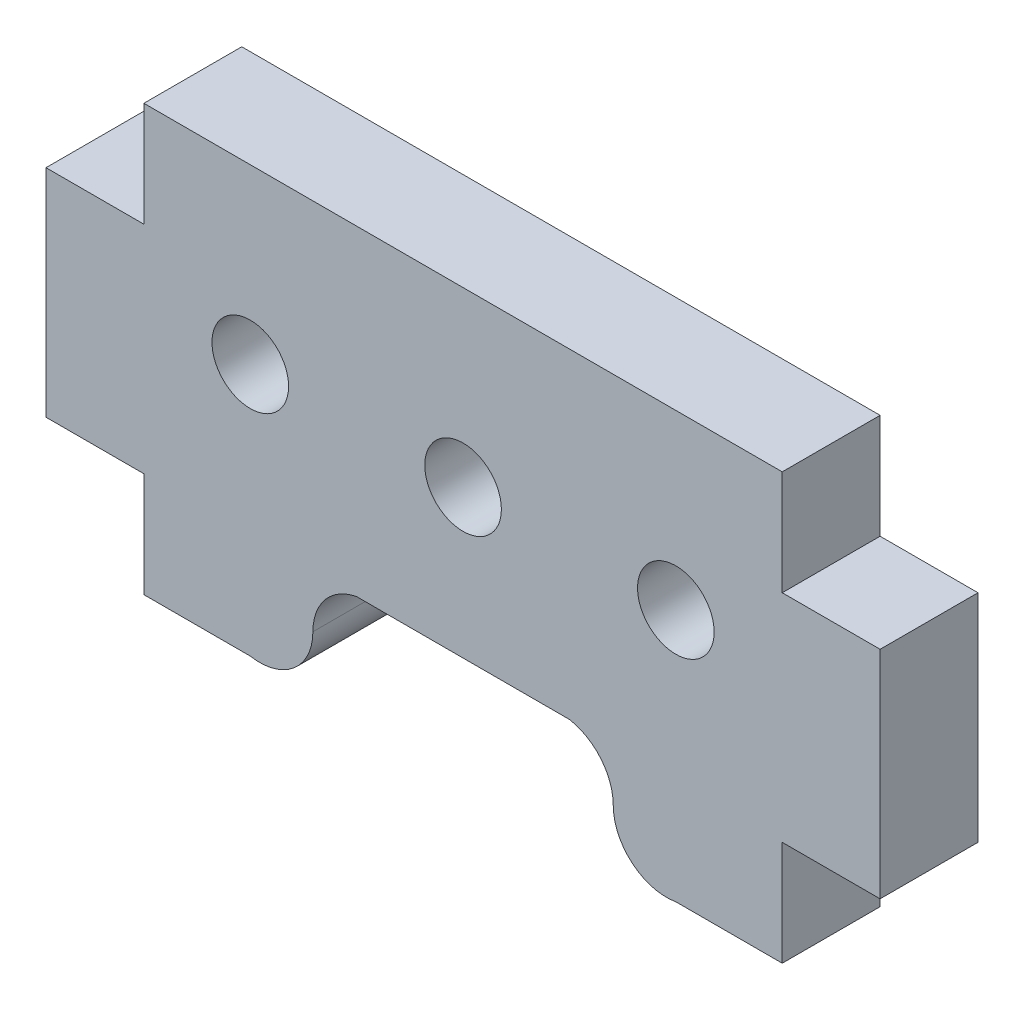
ISO-10303-21;
HEADER;
FILE_DESCRIPTION(('STEP AP214'),'2;1');
FILE_NAME('part.step','',(''),(''),'','','');
FILE_SCHEMA(('AUTOMOTIVE_DESIGN { 1 0 10303 214 1 1 1 1 }'));
ENDSEC;
DATA;
#1=APPLICATION_CONTEXT('core data for automotive mechanical design processes');
#2=APPLICATION_PROTOCOL_DEFINITION('international standard','automotive_design',2000,#1);
#3=PRODUCT_CONTEXT('',#1,'mechanical');
#4=PRODUCT('Part','Part','',(#3));
#5=PRODUCT_RELATED_PRODUCT_CATEGORY('part','',(#4));
#6=PRODUCT_DEFINITION_FORMATION('','',#4);
#7=PRODUCT_DEFINITION_CONTEXT('part definition',#1,'design');
#8=PRODUCT_DEFINITION('design','',#6,#7);
#9=PRODUCT_DEFINITION_SHAPE('','',#8);
#10=(LENGTH_UNIT() NAMED_UNIT(*) SI_UNIT(.MILLI.,.METRE.));
#11=(NAMED_UNIT(*) PLANE_ANGLE_UNIT() SI_UNIT($,.RADIAN.));
#12=(NAMED_UNIT(*) SI_UNIT($,.STERADIAN.) SOLID_ANGLE_UNIT());
#13=UNCERTAINTY_MEASURE_WITH_UNIT(LENGTH_MEASURE(1.E-05),#10,'distance_accuracy_value','');
#14=(GEOMETRIC_REPRESENTATION_CONTEXT(3) GLOBAL_UNCERTAINTY_ASSIGNED_CONTEXT((#13)) GLOBAL_UNIT_ASSIGNED_CONTEXT((#10,
#11,#12)) REPRESENTATION_CONTEXT('',''));
#15=CARTESIAN_POINT('',(0.,0.,0.));
#16=DIRECTION('',(0.,0.,1.));
#17=DIRECTION('',(1.,0.,0.));
#18=AXIS2_PLACEMENT_3D('',#15,#16,#17);
#19=CARTESIAN_POINT('',(-31.188751391984,3.125,5.842));
#20=DIRECTION('',(0.,0.,1.));
#21=DIRECTION('',(1.,0.,0.));
#22=AXIS2_PLACEMENT_3D('',#19,#20,#21);
#23=PLANE('',#22);
#24=CARTESIAN_POINT('',(-19.05,15.0812499999999,5.842));
#25=DIRECTION('',(0.,0.,1.));
#26=DIRECTION('',(1.,0.,0.));
#27=AXIS2_PLACEMENT_3D('',#24,#25,#26);
#28=CIRCLE('',#27,2.286);
#29=CARTESIAN_POINT('',(-16.764,15.0812499999999,5.842));
#30=VERTEX_POINT('',#29);
#31=EDGE_CURVE('E364',#30,#30,#28,.T.);
#32=ORIENTED_EDGE('',*,*,#31,.F.);
#33=EDGE_LOOP('',(#32));
#34=FACE_BOUND('',#33,.T.);
#35=DIRECTION('',(0.,1.,0.));
#36=VECTOR('',#35,1.);
#37=CARTESIAN_POINT('',(0.,0.,5.842));
#38=LINE('',#37,#36);
#39=CARTESIAN_POINT('',(0.,0.,5.842));
#40=VERTEX_POINT('',#39);
#41=CARTESIAN_POINT('',(0.,6.25,5.842));
#42=VERTEX_POINT('',#41);
#43=EDGE_CURVE('E225',#40,#42,#38,.T.);
#44=ORIENTED_EDGE('',*,*,#43,.T.);
#45=DIRECTION('',(1.,0.,0.));
#46=VECTOR('',#45,1.);
#47=CARTESIAN_POINT('',(0.,6.25,5.842));
#48=LINE('',#47,#46);
#49=CARTESIAN_POINT('',(5.84199999999999,6.25,5.842));
#50=VERTEX_POINT('',#49);
#51=EDGE_CURVE('E123',#42,#50,#48,.T.);
#52=ORIENTED_EDGE('',*,*,#51,.T.);
#53=DIRECTION('',(0.,1.,0.));
#54=VECTOR('',#53,1.);
#55=CARTESIAN_POINT('',(5.842,19.15,5.842));
#56=LINE('',#55,#54);
#57=CARTESIAN_POINT('',(5.842,19.15,5.842));
#58=VERTEX_POINT('',#57);
#59=EDGE_CURVE('E270',#50,#58,#56,.T.);
#60=ORIENTED_EDGE('',*,*,#59,.T.);
#61=DIRECTION('',(-1.,0.,0.));
#62=VECTOR('',#61,1.);
#63=CARTESIAN_POINT('',(0.,19.15,5.842));
#64=LINE('',#63,#62);
#65=CARTESIAN_POINT('',(0.,19.15,5.842));
#66=VERTEX_POINT('',#65);
#67=EDGE_CURVE('E289',#58,#66,#64,.T.);
#68=ORIENTED_EDGE('',*,*,#67,.T.);
#69=DIRECTION('',(0.,1.,0.));
#70=VECTOR('',#69,1.);
#71=CARTESIAN_POINT('',(0.,19.15,5.842));
#72=LINE('',#71,#70);
#73=CARTESIAN_POINT('',(0.,25.4,5.842));
#74=VERTEX_POINT('',#73);
#75=EDGE_CURVE('E286',#66,#74,#72,.T.);
#76=ORIENTED_EDGE('',*,*,#75,.T.);
#77=DIRECTION('',(-1.,0.,0.));
#78=VECTOR('',#77,1.);
#79=CARTESIAN_POINT('',(0.,25.4,5.842));
#80=LINE('',#79,#78);
#81=CARTESIAN_POINT('',(-38.1,25.4,5.842));
#82=VERTEX_POINT('',#81);
#83=EDGE_CURVE('E288',#74,#82,#80,.T.);
#84=ORIENTED_EDGE('',*,*,#83,.T.);
#85=DIRECTION('',(0.,-1.,0.));
#86=VECTOR('',#85,1.);
#87=CARTESIAN_POINT('',(-38.1,19.15,5.842));
#88=LINE('',#87,#86);
#89=CARTESIAN_POINT('',(-38.1,19.15,5.842));
#90=VERTEX_POINT('',#89);
#91=EDGE_CURVE('E291',#82,#90,#88,.T.);
#92=ORIENTED_EDGE('',*,*,#91,.T.);
#93=DIRECTION('',(-1.,0.,0.));
#94=VECTOR('',#93,1.);
#95=CARTESIAN_POINT('',(-38.1,19.15,5.842));
#96=LINE('',#95,#94);
#97=CARTESIAN_POINT('',(-43.942,19.15,5.842));
#98=VERTEX_POINT('',#97);
#99=EDGE_CURVE('E297',#90,#98,#96,.T.);
#100=ORIENTED_EDGE('',*,*,#99,.T.);
#101=DIRECTION('',(0.,-1.,0.));
#102=VECTOR('',#101,1.);
#103=CARTESIAN_POINT('',(-43.942,19.15,5.842));
#104=LINE('',#103,#102);
#105=CARTESIAN_POINT('',(-43.942,6.25,5.842));
#106=VERTEX_POINT('',#105);
#107=EDGE_CURVE('E299',#98,#106,#104,.T.);
#108=ORIENTED_EDGE('',*,*,#107,.T.);
#109=DIRECTION('',(1.,0.,0.));
#110=VECTOR('',#109,1.);
#111=CARTESIAN_POINT('',(-38.1,6.25,5.842));
#112=LINE('',#111,#110);
#113=CARTESIAN_POINT('',(-38.1,6.25,5.842));
#114=VERTEX_POINT('',#113);
#115=EDGE_CURVE('E301',#106,#114,#112,.T.);
#116=ORIENTED_EDGE('',*,*,#115,.T.);
#117=DIRECTION('',(0.,-1.,0.));
#118=VECTOR('',#117,1.);
#119=CARTESIAN_POINT('',(-38.1,0.,5.842));
#120=LINE('',#119,#118);
#121=CARTESIAN_POINT('',(-38.1,0.,5.842));
#122=VERTEX_POINT('',#121);
#123=EDGE_CURVE('E303',#114,#122,#120,.T.);
#124=ORIENTED_EDGE('',*,*,#123,.T.);
#125=DIRECTION('',(1.,0.,0.));
#126=VECTOR('',#125,1.);
#127=CARTESIAN_POINT('',(-31.75,0.,5.842));
#128=LINE('',#127,#126);
#129=CARTESIAN_POINT('',(-31.75,0.,5.842));
#130=VERTEX_POINT('',#129);
#131=EDGE_CURVE('E305',#122,#130,#128,.T.);
#132=ORIENTED_EDGE('',*,*,#131,.T.);
#133=CARTESIAN_POINT('',(-31.188751391984,3.125,5.842));
#134=DIRECTION('',(0.,0.,1.));
#135=DIRECTION('',(1.,0.,0.));
#136=AXIS2_PLACEMENT_3D('',#133,#134,#135);
#137=CIRCLE('',#136,3.17499999999999);
#138=CARTESIAN_POINT('',(-28.013751391984,3.125,5.842));
#139=VERTEX_POINT('',#138);
#140=EDGE_CURVE('E307',#130,#139,#137,.T.);
#141=ORIENTED_EDGE('',*,*,#140,.T.);
#142=CARTESIAN_POINT('',(-24.838751391984,3.125,5.842));
#143=DIRECTION('',(0.,0.,-1.));
#144=DIRECTION('',(1.,0.,0.));
#145=AXIS2_PLACEMENT_3D('',#142,#143,#144);
#146=CIRCLE('',#145,3.17499999999999);
#147=CARTESIAN_POINT('',(-25.4,6.25,5.842));
#148=VERTEX_POINT('',#147);
#149=EDGE_CURVE('E309',#139,#148,#146,.T.);
#150=ORIENTED_EDGE('',*,*,#149,.T.);
#151=DIRECTION('',(1.,0.,0.));
#152=VECTOR('',#151,1.);
#153=CARTESIAN_POINT('',(-12.7,6.25,5.842));
#154=LINE('',#153,#152);
#155=CARTESIAN_POINT('',(-12.7,6.25,5.842));
#156=VERTEX_POINT('',#155);
#157=EDGE_CURVE('E172',#148,#156,#154,.T.);
#158=ORIENTED_EDGE('',*,*,#157,.T.);
#159=CARTESIAN_POINT('',(-13.261248608016,3.125,5.842));
#160=DIRECTION('',(0.,0.,-1.));
#161=DIRECTION('',(-1.,0.,0.));
#162=AXIS2_PLACEMENT_3D('',#159,#160,#161);
#163=CIRCLE('',#162,3.17499999999999);
#164=CARTESIAN_POINT('',(-10.086248608016,3.125,5.842));
#165=VERTEX_POINT('',#164);
#166=EDGE_CURVE('E166',#156,#165,#163,.T.);
#167=ORIENTED_EDGE('',*,*,#166,.T.);
#168=CARTESIAN_POINT('',(-6.91124860801605,3.125,5.842));
#169=DIRECTION('',(0.,0.,1.));
#170=DIRECTION('',(-1.,0.,0.));
#171=AXIS2_PLACEMENT_3D('',#168,#169,#170);
#172=CIRCLE('',#171,3.17499999999999);
#173=CARTESIAN_POINT('',(-6.35000000000001,0.,5.842));
#174=VERTEX_POINT('',#173);
#175=EDGE_CURVE('E170',#165,#174,#172,.T.);
#176=ORIENTED_EDGE('',*,*,#175,.T.);
#177=DIRECTION('',(1.,0.,0.));
#178=VECTOR('',#177,1.);
#179=CARTESIAN_POINT('',(0.,0.,5.842));
#180=LINE('',#179,#178);
#181=EDGE_CURVE('E50',#174,#40,#180,.T.);
#182=ORIENTED_EDGE('',*,*,#181,.T.);
#183=EDGE_LOOP('',(#44,#52,#60,#68,#76,#84,#92,#100,#108,#116,#124,#132,#141,#150,#158,#167,
#176,#182));
#184=FACE_BOUND('',#183,.T.);
#185=CARTESIAN_POINT('',(-6.35,15.08125,5.842));
#186=DIRECTION('',(0.,0.,1.));
#187=DIRECTION('',(1.,0.,0.));
#188=AXIS2_PLACEMENT_3D('',#185,#186,#187);
#189=CIRCLE('',#188,2.286);
#190=CARTESIAN_POINT('',(-4.064,15.08125,5.842));
#191=VERTEX_POINT('',#190);
#192=EDGE_CURVE('E194',#191,#191,#189,.T.);
#193=ORIENTED_EDGE('',*,*,#192,.F.);
#194=EDGE_LOOP('',(#193));
#195=FACE_BOUND('',#194,.T.);
#196=CARTESIAN_POINT('',(-31.75,15.0812499999998,5.842));
#197=DIRECTION('',(0.,0.,1.));
#198=DIRECTION('',(1.,0.,0.));
#199=AXIS2_PLACEMENT_3D('',#196,#197,#198);
#200=CIRCLE('',#199,2.286);
#201=CARTESIAN_POINT('',(-29.464,15.0812499999998,5.842));
#202=VERTEX_POINT('',#201);
#203=EDGE_CURVE('E355',#202,#202,#200,.T.);
#204=ORIENTED_EDGE('',*,*,#203,.F.);
#205=EDGE_LOOP('',(#204));
#206=FACE_BOUND('',#205,.T.);
#207=ADVANCED_FACE('F33',(#34,#184,#195,#206),#23,.T.);
#208=CARTESIAN_POINT('',(-31.188751391984,3.125,0.));
#209=DIRECTION('',(0.,0.,1.));
#210=DIRECTION('',(1.,0.,0.));
#211=AXIS2_PLACEMENT_3D('',#208,#209,#210);
#212=PLANE('',#211);
#213=DIRECTION('',(0.,1.,0.));
#214=VECTOR('',#213,1.);
#215=CARTESIAN_POINT('',(0.,0.,0.));
#216=LINE('',#215,#214);
#217=CARTESIAN_POINT('',(0.,0.,0.));
#218=VERTEX_POINT('',#217);
#219=CARTESIAN_POINT('',(0.,6.25,0.));
#220=VERTEX_POINT('',#219);
#221=EDGE_CURVE('E190',#218,#220,#216,.T.);
#222=ORIENTED_EDGE('',*,*,#221,.F.);
#223=DIRECTION('',(1.,0.,0.));
#224=VECTOR('',#223,1.);
#225=CARTESIAN_POINT('',(0.,0.,0.));
#226=LINE('',#225,#224);
#227=CARTESIAN_POINT('',(-6.35000000000001,0.,0.));
#228=VERTEX_POINT('',#227);
#229=EDGE_CURVE('E115',#228,#218,#226,.T.);
#230=ORIENTED_EDGE('',*,*,#229,.F.);
#231=CARTESIAN_POINT('',(-6.91124860801605,3.125,0.));
#232=DIRECTION('',(0.,0.,1.));
#233=DIRECTION('',(-1.,0.,0.));
#234=AXIS2_PLACEMENT_3D('',#231,#232,#233);
#235=CIRCLE('',#234,3.17499999999999);
#236=CARTESIAN_POINT('',(-10.086248608016,3.125,0.));
#237=VERTEX_POINT('',#236);
#238=EDGE_CURVE('E109',#237,#228,#235,.T.);
#239=ORIENTED_EDGE('',*,*,#238,.F.);
#240=CARTESIAN_POINT('',(-13.261248608016,3.125,0.));
#241=DIRECTION('',(0.,0.,-1.));
#242=DIRECTION('',(-1.,0.,0.));
#243=AXIS2_PLACEMENT_3D('',#240,#241,#242);
#244=CIRCLE('',#243,3.17499999999999);
#245=CARTESIAN_POINT('',(-12.7,6.25,0.));
#246=VERTEX_POINT('',#245);
#247=EDGE_CURVE('E180',#246,#237,#244,.T.);
#248=ORIENTED_EDGE('',*,*,#247,.F.);
#249=DIRECTION('',(1.,0.,0.));
#250=VECTOR('',#249,1.);
#251=CARTESIAN_POINT('',(-12.7,6.25,0.));
#252=LINE('',#251,#250);
#253=CARTESIAN_POINT('',(-25.4,6.25,0.));
#254=VERTEX_POINT('',#253);
#255=EDGE_CURVE('E220',#254,#246,#252,.T.);
#256=ORIENTED_EDGE('',*,*,#255,.F.);
#257=CARTESIAN_POINT('',(-24.838751391984,3.125,0.));
#258=DIRECTION('',(0.,0.,-1.));
#259=DIRECTION('',(1.,0.,0.));
#260=AXIS2_PLACEMENT_3D('',#257,#258,#259);
#261=CIRCLE('',#260,3.17499999999999);
#262=CARTESIAN_POINT('',(-28.013751391984,3.125,0.));
#263=VERTEX_POINT('',#262);
#264=EDGE_CURVE('E218',#263,#254,#261,.T.);
#265=ORIENTED_EDGE('',*,*,#264,.F.);
#266=CARTESIAN_POINT('',(-31.188751391984,3.125,0.));
#267=DIRECTION('',(0.,0.,1.));
#268=DIRECTION('',(1.,0.,0.));
#269=AXIS2_PLACEMENT_3D('',#266,#267,#268);
#270=CIRCLE('',#269,3.17499999999999);
#271=CARTESIAN_POINT('',(-31.75,0.,0.));
#272=VERTEX_POINT('',#271);
#273=EDGE_CURVE('E216',#272,#263,#270,.T.);
#274=ORIENTED_EDGE('',*,*,#273,.F.);
#275=DIRECTION('',(1.,0.,0.));
#276=VECTOR('',#275,1.);
#277=CARTESIAN_POINT('',(-31.75,0.,0.));
#278=LINE('',#277,#276);
#279=CARTESIAN_POINT('',(-38.1,0.,0.));
#280=VERTEX_POINT('',#279);
#281=EDGE_CURVE('E214',#280,#272,#278,.T.);
#282=ORIENTED_EDGE('',*,*,#281,.F.);
#283=DIRECTION('',(0.,-1.,0.));
#284=VECTOR('',#283,1.);
#285=CARTESIAN_POINT('',(-38.1,0.,0.));
#286=LINE('',#285,#284);
#287=CARTESIAN_POINT('',(-38.1,6.25,0.));
#288=VERTEX_POINT('',#287);
#289=EDGE_CURVE('E212',#288,#280,#286,.T.);
#290=ORIENTED_EDGE('',*,*,#289,.F.);
#291=DIRECTION('',(1.,0.,0.));
#292=VECTOR('',#291,1.);
#293=CARTESIAN_POINT('',(-38.1,6.25,0.));
#294=LINE('',#293,#292);
#295=CARTESIAN_POINT('',(-43.942,6.25,0.));
#296=VERTEX_POINT('',#295);
#297=EDGE_CURVE('E210',#296,#288,#294,.T.);
#298=ORIENTED_EDGE('',*,*,#297,.F.);
#299=DIRECTION('',(0.,-1.,0.));
#300=VECTOR('',#299,1.);
#301=CARTESIAN_POINT('',(-43.942,19.15,0.));
#302=LINE('',#301,#300);
#303=CARTESIAN_POINT('',(-43.942,19.15,0.));
#304=VERTEX_POINT('',#303);
#305=EDGE_CURVE('E208',#304,#296,#302,.T.);
#306=ORIENTED_EDGE('',*,*,#305,.F.);
#307=DIRECTION('',(-1.,0.,0.));
#308=VECTOR('',#307,1.);
#309=CARTESIAN_POINT('',(-38.1,19.15,0.));
#310=LINE('',#309,#308);
#311=CARTESIAN_POINT('',(-38.1,19.15,0.));
#312=VERTEX_POINT('',#311);
#313=EDGE_CURVE('E206',#312,#304,#310,.T.);
#314=ORIENTED_EDGE('',*,*,#313,.F.);
#315=DIRECTION('',(0.,-1.,0.));
#316=VECTOR('',#315,1.);
#317=CARTESIAN_POINT('',(-38.1,19.15,0.));
#318=LINE('',#317,#316);
#319=CARTESIAN_POINT('',(-38.1,25.4,0.));
#320=VERTEX_POINT('',#319);
#321=EDGE_CURVE('E204',#320,#312,#318,.T.);
#322=ORIENTED_EDGE('',*,*,#321,.F.);
#323=DIRECTION('',(-1.,0.,0.));
#324=VECTOR('',#323,1.);
#325=CARTESIAN_POINT('',(0.,25.4,0.));
#326=LINE('',#325,#324);
#327=CARTESIAN_POINT('',(0.,25.4,0.));
#328=VERTEX_POINT('',#327);
#329=EDGE_CURVE('E202',#328,#320,#326,.T.);
#330=ORIENTED_EDGE('',*,*,#329,.F.);
#331=DIRECTION('',(0.,1.,0.));
#332=VECTOR('',#331,1.);
#333=CARTESIAN_POINT('',(0.,19.15,0.));
#334=LINE('',#333,#332);
#335=CARTESIAN_POINT('',(0.,19.15,0.));
#336=VERTEX_POINT('',#335);
#337=EDGE_CURVE('E200',#336,#328,#334,.T.);
#338=ORIENTED_EDGE('',*,*,#337,.F.);
#339=DIRECTION('',(-1.,0.,0.));
#340=VECTOR('',#339,1.);
#341=CARTESIAN_POINT('',(0.,19.15,0.));
#342=LINE('',#341,#340);
#343=CARTESIAN_POINT('',(5.842,19.15,0.));
#344=VERTEX_POINT('',#343);
#345=EDGE_CURVE('E198',#344,#336,#342,.T.);
#346=ORIENTED_EDGE('',*,*,#345,.F.);
#347=DIRECTION('',(0.,1.,0.));
#348=VECTOR('',#347,1.);
#349=CARTESIAN_POINT('',(5.842,19.15,0.));
#350=LINE('',#349,#348);
#351=CARTESIAN_POINT('',(5.84199999999999,6.25,0.));
#352=VERTEX_POINT('',#351);
#353=EDGE_CURVE('E196',#352,#344,#350,.T.);
#354=ORIENTED_EDGE('',*,*,#353,.F.);
#355=DIRECTION('',(1.,0.,0.));
#356=VECTOR('',#355,1.);
#357=CARTESIAN_POINT('',(0.,6.25,0.));
#358=LINE('',#357,#356);
#359=EDGE_CURVE('E193',#220,#352,#358,.T.);
#360=ORIENTED_EDGE('',*,*,#359,.F.);
#361=EDGE_LOOP('',(#222,#230,#239,#248,#256,#265,#274,#282,#290,#298,#306,#314,#322,#330,#338,
#346,#354,#360));
#362=FACE_BOUND('',#361,.T.);
#363=CARTESIAN_POINT('',(-6.35,15.08125,0.));
#364=DIRECTION('',(0.,0.,1.));
#365=DIRECTION('',(1.,0.,0.));
#366=AXIS2_PLACEMENT_3D('',#363,#364,#365);
#367=CIRCLE('',#366,2.286);
#368=CARTESIAN_POINT('',(-4.064,15.08125,0.));
#369=VERTEX_POINT('',#368);
#370=EDGE_CURVE('E367',#369,#369,#367,.T.);
#371=ORIENTED_EDGE('',*,*,#370,.T.);
#372=EDGE_LOOP('',(#371));
#373=FACE_BOUND('',#372,.T.);
#374=CARTESIAN_POINT('',(-19.05,15.0812499999999,0.));
#375=DIRECTION('',(0.,0.,1.));
#376=DIRECTION('',(1.,0.,0.));
#377=AXIS2_PLACEMENT_3D('',#374,#375,#376);
#378=CIRCLE('',#377,2.286);
#379=CARTESIAN_POINT('',(-16.764,15.0812499999999,0.));
#380=VERTEX_POINT('',#379);
#381=EDGE_CURVE('E361',#380,#380,#378,.T.);
#382=ORIENTED_EDGE('',*,*,#381,.T.);
#383=EDGE_LOOP('',(#382));
#384=FACE_BOUND('',#383,.T.);
#385=CARTESIAN_POINT('',(-31.75,15.0812499999998,0.));
#386=DIRECTION('',(0.,0.,1.));
#387=DIRECTION('',(1.,0.,0.));
#388=AXIS2_PLACEMENT_3D('',#385,#386,#387);
#389=CIRCLE('',#388,2.286);
#390=CARTESIAN_POINT('',(-29.464,15.0812499999998,0.));
#391=VERTEX_POINT('',#390);
#392=EDGE_CURVE('E358',#391,#391,#389,.T.);
#393=ORIENTED_EDGE('',*,*,#392,.T.);
#394=EDGE_LOOP('',(#393));
#395=FACE_BOUND('',#394,.T.);
#396=ADVANCED_FACE('F274',(#362,#373,#384,#395),#212,.F.);
#397=CARTESIAN_POINT('',(0.,0.,5.842));
#398=DIRECTION('',(-1.,0.,0.));
#399=DIRECTION('',(0.,-1.,0.));
#400=AXIS2_PLACEMENT_3D('',#397,#398,#399);
#401=PLANE('',#400);
#402=ORIENTED_EDGE('',*,*,#221,.T.);
#403=DIRECTION('',(0.,0.,-1.));
#404=VECTOR('',#403,1.);
#405=CARTESIAN_POINT('',(0.,6.25,5.842));
#406=LINE('',#405,#404);
#407=EDGE_CURVE('E11',#42,#220,#406,.T.);
#408=ORIENTED_EDGE('',*,*,#407,.F.);
#409=ORIENTED_EDGE('',*,*,#43,.F.);
#410=DIRECTION('',(0.,0.,-1.));
#411=VECTOR('',#410,1.);
#412=CARTESIAN_POINT('',(0.,0.,5.842));
#413=LINE('',#412,#411);
#414=EDGE_CURVE('E186',#40,#218,#413,.T.);
#415=ORIENTED_EDGE('',*,*,#414,.T.);
#416=EDGE_LOOP('',(#402,#408,#409,#415));
#417=FACE_BOUND('',#416,.T.);
#418=ADVANCED_FACE('F35',(#417),#401,.F.);
#419=CARTESIAN_POINT('',(0.,6.25,5.842));
#420=DIRECTION('',(0.,1.,0.));
#421=DIRECTION('',(-1.,0.,0.));
#422=AXIS2_PLACEMENT_3D('',#419,#420,#421);
#423=PLANE('',#422);
#424=ORIENTED_EDGE('',*,*,#359,.T.);
#425=DIRECTION('',(0.,0.,-1.));
#426=VECTOR('',#425,1.);
#427=CARTESIAN_POINT('',(5.84199999999999,6.25,5.842));
#428=LINE('',#427,#426);
#429=EDGE_CURVE('E42',#50,#352,#428,.T.);
#430=ORIENTED_EDGE('',*,*,#429,.F.);
#431=ORIENTED_EDGE('',*,*,#51,.F.);
#432=ORIENTED_EDGE('',*,*,#407,.T.);
#433=EDGE_LOOP('',(#424,#430,#431,#432));
#434=FACE_BOUND('',#433,.T.);
#435=ADVANCED_FACE('F529',(#434),#423,.F.);
#436=CARTESIAN_POINT('',(5.842,19.15,5.842));
#437=DIRECTION('',(-1.,0.,0.));
#438=DIRECTION('',(0.,-1.,0.));
#439=AXIS2_PLACEMENT_3D('',#436,#437,#438);
#440=PLANE('',#439);
#441=ORIENTED_EDGE('',*,*,#353,.T.);
#442=DIRECTION('',(0.,0.,-1.));
#443=VECTOR('',#442,1.);
#444=CARTESIAN_POINT('',(5.842,19.15,5.842));
#445=LINE('',#444,#443);
#446=EDGE_CURVE('E262',#58,#344,#445,.T.);
#447=ORIENTED_EDGE('',*,*,#446,.F.);
#448=ORIENTED_EDGE('',*,*,#59,.F.);
#449=ORIENTED_EDGE('',*,*,#429,.T.);
#450=EDGE_LOOP('',(#441,#447,#448,#449));
#451=FACE_BOUND('',#450,.T.);
#452=ADVANCED_FACE('F268',(#451),#440,.F.);
#453=CARTESIAN_POINT('',(0.,19.15,5.842));
#454=DIRECTION('',(0.,-1.,0.));
#455=DIRECTION('',(0.,0.,-1.));
#456=AXIS2_PLACEMENT_3D('',#453,#454,#455);
#457=PLANE('',#456);
#458=ORIENTED_EDGE('',*,*,#345,.T.);
#459=DIRECTION('',(0.,0.,-1.));
#460=VECTOR('',#459,1.);
#461=CARTESIAN_POINT('',(0.,19.15,5.842));
#462=LINE('',#461,#460);
#463=EDGE_CURVE('E259',#66,#336,#462,.T.);
#464=ORIENTED_EDGE('',*,*,#463,.F.);
#465=ORIENTED_EDGE('',*,*,#67,.F.);
#466=ORIENTED_EDGE('',*,*,#446,.T.);
#467=EDGE_LOOP('',(#458,#464,#465,#466));
#468=FACE_BOUND('',#467,.T.);
#469=ADVANCED_FACE('F280',(#468),#457,.F.);
#470=CARTESIAN_POINT('',(0.,19.15,5.842));
#471=DIRECTION('',(-1.,0.,0.));
#472=DIRECTION('',(0.,-1.,0.));
#473=AXIS2_PLACEMENT_3D('',#470,#471,#472);
#474=PLANE('',#473);
#475=ORIENTED_EDGE('',*,*,#337,.T.);
#476=DIRECTION('',(0.,0.,-1.));
#477=VECTOR('',#476,1.);
#478=CARTESIAN_POINT('',(0.,25.4,5.842));
#479=LINE('',#478,#477);
#480=EDGE_CURVE('E256',#74,#328,#479,.T.);
#481=ORIENTED_EDGE('',*,*,#480,.F.);
#482=ORIENTED_EDGE('',*,*,#75,.F.);
#483=ORIENTED_EDGE('',*,*,#463,.T.);
#484=EDGE_LOOP('',(#475,#481,#482,#483));
#485=FACE_BOUND('',#484,.T.);
#486=ADVANCED_FACE('F284',(#485),#474,.F.);
#487=CARTESIAN_POINT('',(0.,25.4,5.842));
#488=DIRECTION('',(0.,-1.,0.));
#489=DIRECTION('',(0.,0.,-1.));
#490=AXIS2_PLACEMENT_3D('',#487,#488,#489);
#491=PLANE('',#490);
#492=ORIENTED_EDGE('',*,*,#329,.T.);
#493=DIRECTION('',(0.,0.,-1.));
#494=VECTOR('',#493,1.);
#495=CARTESIAN_POINT('',(-38.1,25.4,5.842));
#496=LINE('',#495,#494);
#497=EDGE_CURVE('E253',#82,#320,#496,.T.);
#498=ORIENTED_EDGE('',*,*,#497,.F.);
#499=ORIENTED_EDGE('',*,*,#83,.F.);
#500=ORIENTED_EDGE('',*,*,#480,.T.);
#501=EDGE_LOOP('',(#492,#498,#499,#500));
#502=FACE_BOUND('',#501,.T.);
#503=ADVANCED_FACE('F494',(#502),#491,.F.);
#504=CARTESIAN_POINT('',(-38.1,19.15,5.842));
#505=DIRECTION('',(1.,0.,0.));
#506=DIRECTION('',(0.,1.,0.));
#507=AXIS2_PLACEMENT_3D('',#504,#505,#506);
#508=PLANE('',#507);
#509=ORIENTED_EDGE('',*,*,#321,.T.);
#510=DIRECTION('',(0.,0.,-1.));
#511=VECTOR('',#510,1.);
#512=CARTESIAN_POINT('',(-38.1,19.15,5.842));
#513=LINE('',#512,#511);
#514=EDGE_CURVE('E250',#90,#312,#513,.T.);
#515=ORIENTED_EDGE('',*,*,#514,.F.);
#516=ORIENTED_EDGE('',*,*,#91,.F.);
#517=ORIENTED_EDGE('',*,*,#497,.T.);
#518=EDGE_LOOP('',(#509,#515,#516,#517));
#519=FACE_BOUND('',#518,.T.);
#520=ADVANCED_FACE('F484',(#519),#508,.F.);
#521=CARTESIAN_POINT('',(-38.1,19.15,5.842));
#522=DIRECTION('',(0.,-1.,0.));
#523=DIRECTION('',(0.,0.,-1.));
#524=AXIS2_PLACEMENT_3D('',#521,#522,#523);
#525=PLANE('',#524);
#526=ORIENTED_EDGE('',*,*,#313,.T.);
#527=DIRECTION('',(0.,0.,-1.));
#528=VECTOR('',#527,1.);
#529=CARTESIAN_POINT('',(-43.942,19.15,5.842));
#530=LINE('',#529,#528);
#531=EDGE_CURVE('E247',#98,#304,#530,.T.);
#532=ORIENTED_EDGE('',*,*,#531,.F.);
#533=ORIENTED_EDGE('',*,*,#99,.F.);
#534=ORIENTED_EDGE('',*,*,#514,.T.);
#535=EDGE_LOOP('',(#526,#532,#533,#534));
#536=FACE_BOUND('',#535,.T.);
#537=ADVANCED_FACE('F474',(#536),#525,.F.);
#538=CARTESIAN_POINT('',(-43.942,19.15,5.842));
#539=DIRECTION('',(1.,0.,0.));
#540=DIRECTION('',(0.,1.,0.));
#541=AXIS2_PLACEMENT_3D('',#538,#539,#540);
#542=PLANE('',#541);
#543=ORIENTED_EDGE('',*,*,#305,.T.);
#544=DIRECTION('',(0.,0.,-1.));
#545=VECTOR('',#544,1.);
#546=CARTESIAN_POINT('',(-43.942,6.25,5.842));
#547=LINE('',#546,#545);
#548=EDGE_CURVE('E244',#106,#296,#547,.T.);
#549=ORIENTED_EDGE('',*,*,#548,.F.);
#550=ORIENTED_EDGE('',*,*,#107,.F.);
#551=ORIENTED_EDGE('',*,*,#531,.T.);
#552=EDGE_LOOP('',(#543,#549,#550,#551));
#553=FACE_BOUND('',#552,.T.);
#554=ADVANCED_FACE('F464',(#553),#542,.F.);
#555=CARTESIAN_POINT('',(-38.1,6.25,5.842));
#556=DIRECTION('',(0.,1.,0.));
#557=DIRECTION('',(-1.,0.,0.));
#558=AXIS2_PLACEMENT_3D('',#555,#556,#557);
#559=PLANE('',#558);
#560=ORIENTED_EDGE('',*,*,#297,.T.);
#561=DIRECTION('',(0.,0.,-1.));
#562=VECTOR('',#561,1.);
#563=CARTESIAN_POINT('',(-38.1,6.25,5.842));
#564=LINE('',#563,#562);
#565=EDGE_CURVE('E241',#114,#288,#564,.T.);
#566=ORIENTED_EDGE('',*,*,#565,.F.);
#567=ORIENTED_EDGE('',*,*,#115,.F.);
#568=ORIENTED_EDGE('',*,*,#548,.T.);
#569=EDGE_LOOP('',(#560,#566,#567,#568));
#570=FACE_BOUND('',#569,.T.);
#571=ADVANCED_FACE('F454',(#570),#559,.F.);
#572=CARTESIAN_POINT('',(-38.1,0.,5.842));
#573=DIRECTION('',(1.,0.,0.));
#574=DIRECTION('',(0.,1.,0.));
#575=AXIS2_PLACEMENT_3D('',#572,#573,#574);
#576=PLANE('',#575);
#577=ORIENTED_EDGE('',*,*,#289,.T.);
#578=DIRECTION('',(0.,0.,-1.));
#579=VECTOR('',#578,1.);
#580=CARTESIAN_POINT('',(-38.1,0.,5.842));
#581=LINE('',#580,#579);
#582=EDGE_CURVE('E238',#122,#280,#581,.T.);
#583=ORIENTED_EDGE('',*,*,#582,.F.);
#584=ORIENTED_EDGE('',*,*,#123,.F.);
#585=ORIENTED_EDGE('',*,*,#565,.T.);
#586=EDGE_LOOP('',(#577,#583,#584,#585));
#587=FACE_BOUND('',#586,.T.);
#588=ADVANCED_FACE('F444',(#587),#576,.F.);
#589=CARTESIAN_POINT('',(-31.75,0.,5.842));
#590=DIRECTION('',(0.,1.,0.));
#591=DIRECTION('',(-1.,0.,0.));
#592=AXIS2_PLACEMENT_3D('',#589,#590,#591);
#593=PLANE('',#592);
#594=ORIENTED_EDGE('',*,*,#281,.T.);
#595=DIRECTION('',(0.,0.,-1.));
#596=VECTOR('',#595,1.);
#597=CARTESIAN_POINT('',(-31.75,0.,5.842));
#598=LINE('',#597,#596);
#599=EDGE_CURVE('E235',#130,#272,#598,.T.);
#600=ORIENTED_EDGE('',*,*,#599,.F.);
#601=ORIENTED_EDGE('',*,*,#131,.F.);
#602=ORIENTED_EDGE('',*,*,#582,.T.);
#603=EDGE_LOOP('',(#594,#600,#601,#602));
#604=FACE_BOUND('',#603,.T.);
#605=ADVANCED_FACE('F434',(#604),#593,.F.);
#606=CARTESIAN_POINT('',(-31.188751391984,3.125,5.842));
#607=DIRECTION('',(0.,0.,-1.));
#608=DIRECTION('',(-1.,0.,0.));
#609=AXIS2_PLACEMENT_3D('',#606,#607,#608);
#610=CYLINDRICAL_SURFACE('',#609,3.17499999999999);
#611=ORIENTED_EDGE('',*,*,#273,.T.);
#612=DIRECTION('',(0.,0.,-1.));
#613=VECTOR('',#612,1.);
#614=CARTESIAN_POINT('',(-28.013751391984,3.125,5.842));
#615=LINE('',#614,#613);
#616=EDGE_CURVE('E232',#139,#263,#615,.T.);
#617=ORIENTED_EDGE('',*,*,#616,.F.);
#618=ORIENTED_EDGE('',*,*,#140,.F.);
#619=ORIENTED_EDGE('',*,*,#599,.T.);
#620=EDGE_LOOP('',(#611,#617,#618,#619));
#621=FACE_BOUND('',#620,.T.);
#622=ADVANCED_FACE('F425',(#621),#610,.T.);
#623=CARTESIAN_POINT('',(-24.838751391984,3.125,5.842));
#624=DIRECTION('',(0.,0.,-1.));
#625=DIRECTION('',(-1.,0.,0.));
#626=AXIS2_PLACEMENT_3D('',#623,#624,#625);
#627=CYLINDRICAL_SURFACE('',#626,3.17499999999999);
#628=ORIENTED_EDGE('',*,*,#264,.T.);
#629=DIRECTION('',(0.,0.,-1.));
#630=VECTOR('',#629,1.);
#631=CARTESIAN_POINT('',(-25.4,6.25,5.842));
#632=LINE('',#631,#630);
#633=EDGE_CURVE('E229',#148,#254,#632,.T.);
#634=ORIENTED_EDGE('',*,*,#633,.F.);
#635=ORIENTED_EDGE('',*,*,#149,.F.);
#636=ORIENTED_EDGE('',*,*,#616,.T.);
#637=EDGE_LOOP('',(#628,#634,#635,#636));
#638=FACE_BOUND('',#637,.T.);
#639=ADVANCED_FACE('F315',(#638),#627,.F.);
#640=CARTESIAN_POINT('',(-12.7,6.25,5.842));
#641=DIRECTION('',(0.,1.,0.));
#642=DIRECTION('',(0.,0.,1.));
#643=AXIS2_PLACEMENT_3D('',#640,#641,#642);
#644=PLANE('',#643);
#645=ORIENTED_EDGE('',*,*,#255,.T.);
#646=DIRECTION('',(0.,0.,-1.));
#647=VECTOR('',#646,1.);
#648=CARTESIAN_POINT('',(-12.7,6.25,5.842));
#649=LINE('',#648,#647);
#650=EDGE_CURVE('E181',#156,#246,#649,.T.);
#651=ORIENTED_EDGE('',*,*,#650,.F.);
#652=ORIENTED_EDGE('',*,*,#157,.F.);
#653=ORIENTED_EDGE('',*,*,#633,.T.);
#654=EDGE_LOOP('',(#645,#651,#652,#653));
#655=FACE_BOUND('',#654,.T.);
#656=ADVANCED_FACE('F319',(#655),#644,.F.);
#657=CARTESIAN_POINT('',(-13.261248608016,3.125,5.842));
#658=DIRECTION('',(0.,0.,-1.));
#659=DIRECTION('',(-1.,0.,0.));
#660=AXIS2_PLACEMENT_3D('',#657,#658,#659);
#661=CYLINDRICAL_SURFACE('',#660,3.17499999999999);
#662=ORIENTED_EDGE('',*,*,#247,.T.);
#663=DIRECTION('',(0.,0.,-1.));
#664=VECTOR('',#663,1.);
#665=CARTESIAN_POINT('',(-10.086248608016,3.125,5.842));
#666=LINE('',#665,#664);
#667=EDGE_CURVE('E177',#165,#237,#666,.T.);
#668=ORIENTED_EDGE('',*,*,#667,.F.);
#669=ORIENTED_EDGE('',*,*,#166,.F.);
#670=ORIENTED_EDGE('',*,*,#650,.T.);
#671=EDGE_LOOP('',(#662,#668,#669,#670));
#672=FACE_BOUND('',#671,.T.);
#673=ADVANCED_FACE('F178',(#672),#661,.F.);
#674=CARTESIAN_POINT('',(-6.91124860801605,3.125,5.842));
#675=DIRECTION('',(0.,0.,-1.));
#676=DIRECTION('',(-1.,0.,0.));
#677=AXIS2_PLACEMENT_3D('',#674,#675,#676);
#678=CYLINDRICAL_SURFACE('',#677,3.17499999999999);
#679=ORIENTED_EDGE('',*,*,#238,.T.);
#680=DIRECTION('',(0.,0.,-1.));
#681=VECTOR('',#680,1.);
#682=CARTESIAN_POINT('',(-6.35000000000001,0.,5.842));
#683=LINE('',#682,#681);
#684=EDGE_CURVE('E182',#174,#228,#683,.T.);
#685=ORIENTED_EDGE('',*,*,#684,.F.);
#686=ORIENTED_EDGE('',*,*,#175,.F.);
#687=ORIENTED_EDGE('',*,*,#667,.T.);
#688=EDGE_LOOP('',(#679,#685,#686,#687));
#689=FACE_BOUND('',#688,.T.);
#690=ADVANCED_FACE('F184',(#689),#678,.T.);
#691=CARTESIAN_POINT('',(0.,0.,5.842));
#692=DIRECTION('',(0.,1.,0.));
#693=DIRECTION('',(-1.,0.,0.));
#694=AXIS2_PLACEMENT_3D('',#691,#692,#693);
#695=PLANE('',#694);
#696=ORIENTED_EDGE('',*,*,#229,.T.);
#697=ORIENTED_EDGE('',*,*,#414,.F.);
#698=ORIENTED_EDGE('',*,*,#181,.F.);
#699=ORIENTED_EDGE('',*,*,#684,.T.);
#700=EDGE_LOOP('',(#696,#697,#698,#699));
#701=FACE_BOUND('',#700,.T.);
#702=ADVANCED_FACE('F323',(#701),#695,.F.);
#703=CARTESIAN_POINT('',(-6.35,15.08125,5.842));
#704=DIRECTION('',(0.,0.,-1.));
#705=DIRECTION('',(-1.,0.,0.));
#706=AXIS2_PLACEMENT_3D('',#703,#704,#705);
#707=CYLINDRICAL_SURFACE('',#706,2.286);
#708=ORIENTED_EDGE('',*,*,#192,.T.);
#709=EDGE_LOOP('',(#708));
#710=FACE_BOUND('',#709,.T.);
#711=ORIENTED_EDGE('',*,*,#370,.F.);
#712=EDGE_LOOP('',(#711));
#713=FACE_BOUND('',#712,.T.);
#714=ADVANCED_FACE('F325',(#710,#713),#707,.F.);
#715=CARTESIAN_POINT('',(-19.05,15.0812499999999,5.842));
#716=DIRECTION('',(0.,0.,-1.));
#717=DIRECTION('',(-1.,0.,0.));
#718=AXIS2_PLACEMENT_3D('',#715,#716,#717);
#719=CYLINDRICAL_SURFACE('',#718,2.286);
#720=ORIENTED_EDGE('',*,*,#31,.T.);
#721=EDGE_LOOP('',(#720));
#722=FACE_BOUND('',#721,.T.);
#723=ORIENTED_EDGE('',*,*,#381,.F.);
#724=EDGE_LOOP('',(#723));
#725=FACE_BOUND('',#724,.T.);
#726=ADVANCED_FACE('F331',(#722,#725),#719,.F.);
#727=CARTESIAN_POINT('',(-31.75,15.0812499999998,5.842));
#728=DIRECTION('',(0.,0.,-1.));
#729=DIRECTION('',(-1.,0.,0.));
#730=AXIS2_PLACEMENT_3D('',#727,#728,#729);
#731=CYLINDRICAL_SURFACE('',#730,2.286);
#732=ORIENTED_EDGE('',*,*,#203,.T.);
#733=EDGE_LOOP('',(#732));
#734=FACE_BOUND('',#733,.T.);
#735=ORIENTED_EDGE('',*,*,#392,.F.);
#736=EDGE_LOOP('',(#735));
#737=FACE_BOUND('',#736,.T.);
#738=ADVANCED_FACE('F346',(#734,#737),#731,.F.);
#739=CLOSED_SHELL('',(#207,#396,#418,#435,#452,#469,#486,#503,#520,#537,#554,#571,#588,#605,
#622,#639,#656,#673,#690,#702,#714,#726,#738));
#740=MANIFOLD_SOLID_BREP('B2',#739);
#741=ADVANCED_BREP_SHAPE_REPRESENTATION('',(#18,#740),#14);
#742=SHAPE_DEFINITION_REPRESENTATION(#9,#741);
ENDSEC;
END-ISO-10303-21;
